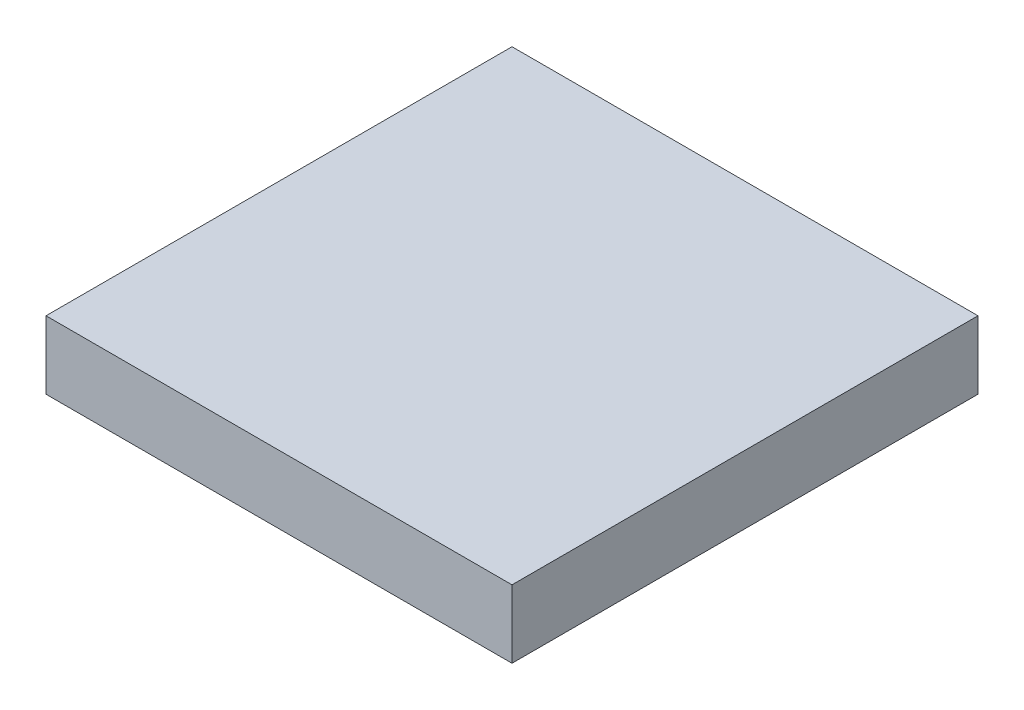
ISO-10303-21;
HEADER;
FILE_DESCRIPTION(('STEP AP214'),'2;1');
FILE_NAME('part.step','',(''),(''),'','','');
FILE_SCHEMA(('AUTOMOTIVE_DESIGN { 1 0 10303 214 1 1 1 1 }'));
ENDSEC;
DATA;
#1=APPLICATION_CONTEXT('core data for automotive mechanical design processes');
#2=APPLICATION_PROTOCOL_DEFINITION('international standard','automotive_design',2000,#1);
#3=PRODUCT_CONTEXT('',#1,'mechanical');
#4=PRODUCT('Part','Part','',(#3));
#5=PRODUCT_RELATED_PRODUCT_CATEGORY('part','',(#4));
#6=PRODUCT_DEFINITION_FORMATION('','',#4);
#7=PRODUCT_DEFINITION_CONTEXT('part definition',#1,'design');
#8=PRODUCT_DEFINITION('design','',#6,#7);
#9=PRODUCT_DEFINITION_SHAPE('','',#8);
#10=(LENGTH_UNIT() NAMED_UNIT(*) SI_UNIT(.MILLI.,.METRE.));
#11=(NAMED_UNIT(*) PLANE_ANGLE_UNIT() SI_UNIT($,.RADIAN.));
#12=(NAMED_UNIT(*) SI_UNIT($,.STERADIAN.) SOLID_ANGLE_UNIT());
#13=UNCERTAINTY_MEASURE_WITH_UNIT(LENGTH_MEASURE(1.E-05),#10,'distance_accuracy_value','');
#14=(GEOMETRIC_REPRESENTATION_CONTEXT(3) GLOBAL_UNCERTAINTY_ASSIGNED_CONTEXT((#13)) GLOBAL_UNIT_ASSIGNED_CONTEXT((#10,
#11,#12)) REPRESENTATION_CONTEXT('',''));
#15=CARTESIAN_POINT('',(0.,0.,0.));
#16=DIRECTION('',(0.,0.,1.));
#17=DIRECTION('',(1.,0.,0.));
#18=AXIS2_PLACEMENT_3D('',#15,#16,#17);
#19=CARTESIAN_POINT('',(-76.2,-11.1125,76.2));
#20=DIRECTION('',(1.,0.,0.));
#21=DIRECTION('',(0.,0.,-1.));
#22=AXIS2_PLACEMENT_3D('',#19,#20,#21);
#23=PLANE('',#22);
#24=DIRECTION('',(0.,-1.,0.));
#25=VECTOR('',#24,1.);
#26=CARTESIAN_POINT('',(-76.2,-11.1125,-76.2));
#27=LINE('',#26,#25);
#28=CARTESIAN_POINT('',(-76.2,11.1125,-76.2));
#29=VERTEX_POINT('',#28);
#30=CARTESIAN_POINT('',(-76.2,-11.1125,-76.2));
#31=VERTEX_POINT('',#30);
#32=EDGE_CURVE('E97',#29,#31,#27,.T.);
#33=ORIENTED_EDGE('',*,*,#32,.T.);
#34=DIRECTION('',(0.,0.,-1.));
#35=VECTOR('',#34,1.);
#36=CARTESIAN_POINT('',(-76.2,-11.1125,76.2));
#37=LINE('',#36,#35);
#38=CARTESIAN_POINT('',(-76.2,-11.1125,76.2));
#39=VERTEX_POINT('',#38);
#40=EDGE_CURVE('E11',#39,#31,#37,.T.);
#41=ORIENTED_EDGE('',*,*,#40,.F.);
#42=DIRECTION('',(0.,-1.,0.));
#43=VECTOR('',#42,1.);
#44=CARTESIAN_POINT('',(-76.2,-11.1125,76.2));
#45=LINE('',#44,#43);
#46=CARTESIAN_POINT('',(-76.2,11.1125,76.2));
#47=VERTEX_POINT('',#46);
#48=EDGE_CURVE('E85',#47,#39,#45,.T.);
#49=ORIENTED_EDGE('',*,*,#48,.F.);
#50=DIRECTION('',(0.,0.,-1.));
#51=VECTOR('',#50,1.);
#52=CARTESIAN_POINT('',(-76.2,11.1125,76.2));
#53=LINE('',#52,#51);
#54=EDGE_CURVE('E93',#47,#29,#53,.T.);
#55=ORIENTED_EDGE('',*,*,#54,.T.);
#56=EDGE_LOOP('',(#33,#41,#49,#55));
#57=FACE_BOUND('',#56,.T.);
#58=ADVANCED_FACE('F34',(#57),#23,.F.);
#59=CARTESIAN_POINT('',(76.2,-11.1125,76.2));
#60=DIRECTION('',(0.,1.,0.));
#61=DIRECTION('',(0.,0.,1.));
#62=AXIS2_PLACEMENT_3D('',#59,#60,#61);
#63=PLANE('',#62);
#64=DIRECTION('',(1.,0.,0.));
#65=VECTOR('',#64,1.);
#66=CARTESIAN_POINT('',(76.2,-11.1125,-76.2));
#67=LINE('',#66,#65);
#68=CARTESIAN_POINT('',(76.2,-11.1125,-76.2));
#69=VERTEX_POINT('',#68);
#70=EDGE_CURVE('E89',#31,#69,#67,.T.);
#71=ORIENTED_EDGE('',*,*,#70,.T.);
#72=DIRECTION('',(0.,0.,-1.));
#73=VECTOR('',#72,1.);
#74=CARTESIAN_POINT('',(76.2,-11.1125,76.2));
#75=LINE('',#74,#73);
#76=CARTESIAN_POINT('',(76.2,-11.1125,76.2));
#77=VERTEX_POINT('',#76);
#78=EDGE_CURVE('E42',#77,#69,#75,.T.);
#79=ORIENTED_EDGE('',*,*,#78,.F.);
#80=DIRECTION('',(1.,0.,0.));
#81=VECTOR('',#80,1.);
#82=CARTESIAN_POINT('',(76.2,-11.1125,76.2));
#83=LINE('',#82,#81);
#84=EDGE_CURVE('E80',#39,#77,#83,.T.);
#85=ORIENTED_EDGE('',*,*,#84,.F.);
#86=ORIENTED_EDGE('',*,*,#40,.T.);
#87=EDGE_LOOP('',(#71,#79,#85,#86));
#88=FACE_BOUND('',#87,.T.);
#89=ADVANCED_FACE('F88',(#88),#63,.F.);
#90=CARTESIAN_POINT('',(76.2,11.1125,76.2));
#91=DIRECTION('',(-1.,0.,0.));
#92=DIRECTION('',(0.,0.,1.));
#93=AXIS2_PLACEMENT_3D('',#90,#91,#92);
#94=PLANE('',#93);
#95=DIRECTION('',(0.,1.,0.));
#96=VECTOR('',#95,1.);
#97=CARTESIAN_POINT('',(76.2,11.1125,-76.2));
#98=LINE('',#97,#96);
#99=CARTESIAN_POINT('',(76.2,11.1125,-76.2));
#100=VERTEX_POINT('',#99);
#101=EDGE_CURVE('E67',#69,#100,#98,.T.);
#102=ORIENTED_EDGE('',*,*,#101,.T.);
#103=DIRECTION('',(0.,0.,-1.));
#104=VECTOR('',#103,1.);
#105=CARTESIAN_POINT('',(76.2,11.1125,76.2));
#106=LINE('',#105,#104);
#107=CARTESIAN_POINT('',(76.2,11.1125,76.2));
#108=VERTEX_POINT('',#107);
#109=EDGE_CURVE('E90',#108,#100,#106,.T.);
#110=ORIENTED_EDGE('',*,*,#109,.F.);
#111=DIRECTION('',(0.,1.,0.));
#112=VECTOR('',#111,1.);
#113=CARTESIAN_POINT('',(76.2,11.1125,76.2));
#114=LINE('',#113,#112);
#115=EDGE_CURVE('E83',#77,#108,#114,.T.);
#116=ORIENTED_EDGE('',*,*,#115,.F.);
#117=ORIENTED_EDGE('',*,*,#78,.T.);
#118=EDGE_LOOP('',(#102,#110,#116,#117));
#119=FACE_BOUND('',#118,.T.);
#120=ADVANCED_FACE('F91',(#119),#94,.F.);
#121=CARTESIAN_POINT('',(-76.2,11.1125,76.2));
#122=DIRECTION('',(0.,-1.,0.));
#123=DIRECTION('',(0.,0.,-1.));
#124=AXIS2_PLACEMENT_3D('',#121,#122,#123);
#125=PLANE('',#124);
#126=DIRECTION('',(-1.,0.,0.));
#127=VECTOR('',#126,1.);
#128=CARTESIAN_POINT('',(-76.2,11.1125,-76.2));
#129=LINE('',#128,#127);
#130=EDGE_CURVE('E73',#100,#29,#129,.T.);
#131=ORIENTED_EDGE('',*,*,#130,.T.);
#132=ORIENTED_EDGE('',*,*,#54,.F.);
#133=DIRECTION('',(-1.,0.,0.));
#134=VECTOR('',#133,1.);
#135=CARTESIAN_POINT('',(-76.2,11.1125,76.2));
#136=LINE('',#135,#134);
#137=EDGE_CURVE('E50',#108,#47,#136,.T.);
#138=ORIENTED_EDGE('',*,*,#137,.F.);
#139=ORIENTED_EDGE('',*,*,#109,.T.);
#140=EDGE_LOOP('',(#131,#132,#138,#139));
#141=FACE_BOUND('',#140,.T.);
#142=ADVANCED_FACE('F104',(#141),#125,.F.);
#143=CARTESIAN_POINT('',(0.,0.,76.2));
#144=DIRECTION('',(0.,0.,-1.));
#145=DIRECTION('',(-1.,0.,0.));
#146=AXIS2_PLACEMENT_3D('',#143,#144,#145);
#147=PLANE('',#146);
#148=ORIENTED_EDGE('',*,*,#48,.T.);
#149=ORIENTED_EDGE('',*,*,#84,.T.);
#150=ORIENTED_EDGE('',*,*,#115,.T.);
#151=ORIENTED_EDGE('',*,*,#137,.T.);
#152=EDGE_LOOP('',(#148,#149,#150,#151));
#153=FACE_BOUND('',#152,.T.);
#154=ADVANCED_FACE('F81',(#153),#147,.F.);
#155=CARTESIAN_POINT('',(0.,0.,-76.2));
#156=DIRECTION('',(0.,0.,-1.));
#157=DIRECTION('',(-1.,0.,0.));
#158=AXIS2_PLACEMENT_3D('',#155,#156,#157);
#159=PLANE('',#158);
#160=ORIENTED_EDGE('',*,*,#32,.F.);
#161=ORIENTED_EDGE('',*,*,#130,.F.);
#162=ORIENTED_EDGE('',*,*,#101,.F.);
#163=ORIENTED_EDGE('',*,*,#70,.F.);
#164=EDGE_LOOP('',(#160,#161,#162,#163));
#165=FACE_BOUND('',#164,.T.);
#166=ADVANCED_FACE('F107',(#165),#159,.T.);
#167=CLOSED_SHELL('',(#58,#89,#120,#142,#154,#166));
#168=MANIFOLD_SOLID_BREP('B2',#167);
#169=ADVANCED_BREP_SHAPE_REPRESENTATION('',(#18,#168),#14);
#170=SHAPE_DEFINITION_REPRESENTATION(#9,#169);
ENDSEC;
END-ISO-10303-21;
